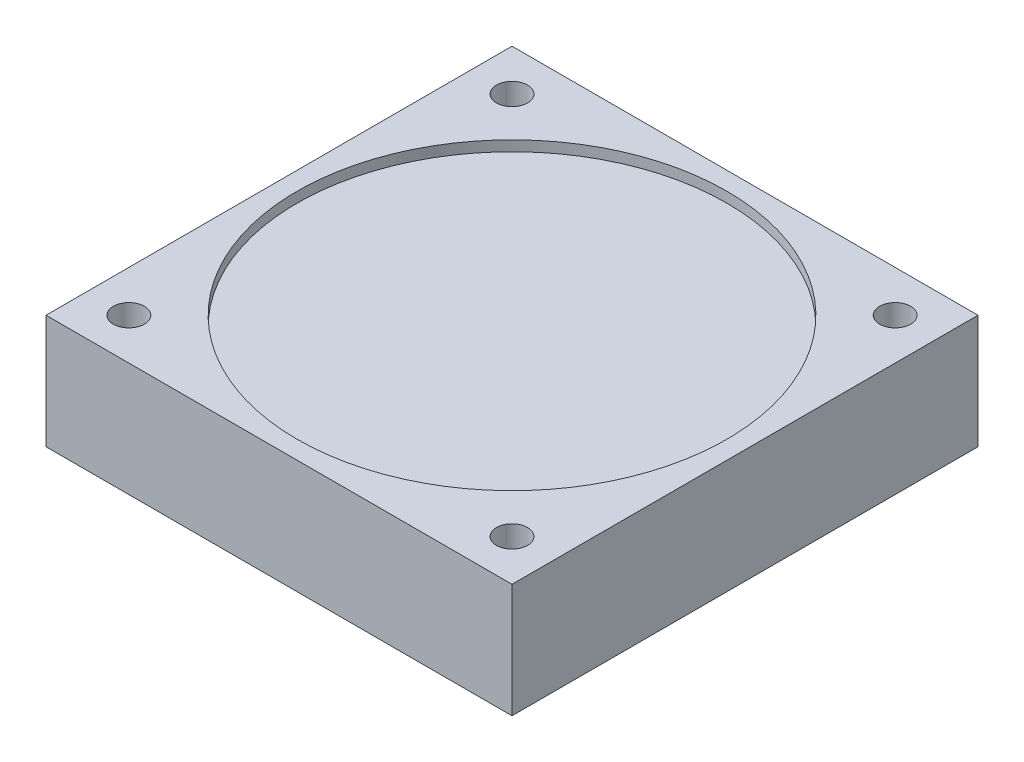
ISO-10303-21;
HEADER;
FILE_DESCRIPTION(('STEP AP214'),'2;1');
FILE_NAME('part.step','',(''),(''),'','','');
FILE_SCHEMA(('AUTOMOTIVE_DESIGN { 1 0 10303 214 1 1 1 1 }'));
ENDSEC;
DATA;
#1=APPLICATION_CONTEXT('core data for automotive mechanical design processes');
#2=APPLICATION_PROTOCOL_DEFINITION('international standard','automotive_design',2000,#1);
#3=PRODUCT_CONTEXT('',#1,'mechanical');
#4=PRODUCT('Part','Part','',(#3));
#5=PRODUCT_RELATED_PRODUCT_CATEGORY('part','',(#4));
#6=PRODUCT_DEFINITION_FORMATION('','',#4);
#7=PRODUCT_DEFINITION_CONTEXT('part definition',#1,'design');
#8=PRODUCT_DEFINITION('design','',#6,#7);
#9=PRODUCT_DEFINITION_SHAPE('','',#8);
#10=(LENGTH_UNIT() NAMED_UNIT(*) SI_UNIT(.MILLI.,.METRE.));
#11=(NAMED_UNIT(*) PLANE_ANGLE_UNIT() SI_UNIT($,.RADIAN.));
#12=(NAMED_UNIT(*) SI_UNIT($,.STERADIAN.) SOLID_ANGLE_UNIT());
#13=UNCERTAINTY_MEASURE_WITH_UNIT(LENGTH_MEASURE(1.E-05),#10,'distance_accuracy_value','');
#14=(GEOMETRIC_REPRESENTATION_CONTEXT(3) GLOBAL_UNCERTAINTY_ASSIGNED_CONTEXT((#13)) GLOBAL_UNIT_ASSIGNED_CONTEXT((#10,
#11,#12)) REPRESENTATION_CONTEXT('',''));
#15=CARTESIAN_POINT('',(0.,0.,0.));
#16=DIRECTION('',(0.,0.,1.));
#17=DIRECTION('',(1.,0.,0.));
#18=AXIS2_PLACEMENT_3D('',#15,#16,#17);
#19=CARTESIAN_POINT('',(0.,11.,0.));
#20=DIRECTION('',(0.,-1.,0.));
#21=DIRECTION('',(0.,0.,-1.));
#22=AXIS2_PLACEMENT_3D('',#19,#20,#21);
#23=PLANE('',#22);
#24=CARTESIAN_POINT('',(-3.66279069767441,11.,-9.81104651162788));
#25=DIRECTION('',(0.,1.,0.));
#26=DIRECTION('',(0.,0.,1.));
#27=AXIS2_PLACEMENT_3D('',#24,#25,#26);
#28=CIRCLE('',#27,20.75);
#29=CARTESIAN_POINT('',(-3.66279069767441,11.,10.9389534883721));
#30=VERTEX_POINT('',#29);
#31=EDGE_CURVE('E148',#30,#30,#28,.T.);
#32=ORIENTED_EDGE('',*,*,#31,.F.);
#33=EDGE_LOOP('',(#32));
#34=FACE_BOUND('',#33,.T.);
#35=DIRECTION('',(0.,0.,1.));
#36=VECTOR('',#35,1.);
#37=CARTESIAN_POINT('',(-26.1627906976744,11.,12.6889534883721));
#38=LINE('',#37,#36);
#39=CARTESIAN_POINT('',(-26.1627906976744,11.,-32.3110465116279));
#40=VERTEX_POINT('',#39);
#41=CARTESIAN_POINT('',(-26.1627906976744,11.,12.6889534883721));
#42=VERTEX_POINT('',#41);
#43=EDGE_CURVE('E97',#40,#42,#38,.T.);
#44=ORIENTED_EDGE('',*,*,#43,.T.);
#45=DIRECTION('',(1.,0.,0.));
#46=VECTOR('',#45,1.);
#47=CARTESIAN_POINT('',(-26.1627906976744,11.,12.6889534883721));
#48=LINE('',#47,#46);
#49=CARTESIAN_POINT('',(18.8372093023256,11.,12.6889534883721));
#50=VERTEX_POINT('',#49);
#51=EDGE_CURVE('E92',#42,#50,#48,.T.);
#52=ORIENTED_EDGE('',*,*,#51,.T.);
#53=DIRECTION('',(0.,0.,-1.));
#54=VECTOR('',#53,1.);
#55=CARTESIAN_POINT('',(18.8372093023256,11.,12.6889534883721));
#56=LINE('',#55,#54);
#57=CARTESIAN_POINT('',(18.8372093023256,11.,-32.3110465116279));
#58=VERTEX_POINT('',#57);
#59=EDGE_CURVE('E95',#50,#58,#56,.T.);
#60=ORIENTED_EDGE('',*,*,#59,.T.);
#61=DIRECTION('',(-1.,0.,0.));
#62=VECTOR('',#61,1.);
#63=CARTESIAN_POINT('',(-26.1627906976744,11.,-32.3110465116279));
#64=LINE('',#63,#62);
#65=EDGE_CURVE('E62',#58,#40,#64,.T.);
#66=ORIENTED_EDGE('',*,*,#65,.T.);
#67=EDGE_LOOP('',(#44,#52,#60,#66));
#68=FACE_BOUND('',#67,.T.);
#69=CARTESIAN_POINT('',(-22.1627906976744,11.,-28.3110465116279));
#70=DIRECTION('',(0.,1.,0.));
#71=DIRECTION('',(0.,0.,1.));
#72=AXIS2_PLACEMENT_3D('',#69,#70,#71);
#73=CIRCLE('',#72,1.5);
#74=CARTESIAN_POINT('',(-22.1627906976744,11.,-26.8110465116279));
#75=VERTEX_POINT('',#74);
#76=EDGE_CURVE('E112',#75,#75,#73,.T.);
#77=ORIENTED_EDGE('',*,*,#76,.F.);
#78=EDGE_LOOP('',(#77));
#79=FACE_BOUND('',#78,.T.);
#80=CARTESIAN_POINT('',(14.8372093023256,11.,-28.3110465116279));
#81=DIRECTION('',(0.,1.,0.));
#82=DIRECTION('',(0.,0.,1.));
#83=AXIS2_PLACEMENT_3D('',#80,#81,#82);
#84=CIRCLE('',#83,1.5);
#85=CARTESIAN_POINT('',(14.8372093023256,11.,-26.8110465116279));
#86=VERTEX_POINT('',#85);
#87=EDGE_CURVE('E127',#86,#86,#84,.T.);
#88=ORIENTED_EDGE('',*,*,#87,.F.);
#89=EDGE_LOOP('',(#88));
#90=FACE_BOUND('',#89,.T.);
#91=CARTESIAN_POINT('',(-22.1627906976744,11.,8.68895348837212));
#92=DIRECTION('',(0.,1.,0.));
#93=DIRECTION('',(0.,0.,1.));
#94=AXIS2_PLACEMENT_3D('',#91,#92,#93);
#95=CIRCLE('',#94,1.5);
#96=CARTESIAN_POINT('',(-22.1627906976744,11.,10.1889534883721));
#97=VERTEX_POINT('',#96);
#98=EDGE_CURVE('E133',#97,#97,#95,.T.);
#99=ORIENTED_EDGE('',*,*,#98,.F.);
#100=EDGE_LOOP('',(#99));
#101=FACE_BOUND('',#100,.T.);
#102=CARTESIAN_POINT('',(14.8372093023256,11.,8.68895348837212));
#103=DIRECTION('',(0.,1.,0.));
#104=DIRECTION('',(0.,0.,1.));
#105=AXIS2_PLACEMENT_3D('',#102,#103,#104);
#106=CIRCLE('',#105,1.5);
#107=CARTESIAN_POINT('',(14.8372093023256,11.,10.1889534883721));
#108=VERTEX_POINT('',#107);
#109=EDGE_CURVE('E139',#108,#108,#106,.T.);
#110=ORIENTED_EDGE('',*,*,#109,.F.);
#111=EDGE_LOOP('',(#110));
#112=FACE_BOUND('',#111,.T.);
#113=ADVANCED_FACE('F45',(#34,#68,#79,#90,#101,#112),#23,.F.);
#114=CARTESIAN_POINT('',(0.,0.,0.));
#115=DIRECTION('',(0.,-1.,0.));
#116=DIRECTION('',(0.,0.,-1.));
#117=AXIS2_PLACEMENT_3D('',#114,#115,#116);
#118=PLANE('',#117);
#119=CARTESIAN_POINT('',(-22.1627906976744,0.,8.68895348837212));
#120=DIRECTION('',(0.,1.,0.));
#121=DIRECTION('',(0.,0.,1.));
#122=AXIS2_PLACEMENT_3D('',#119,#120,#121);
#123=CIRCLE('',#122,1.5);
#124=CARTESIAN_POINT('',(-22.1627906976744,0.,10.1889534883721));
#125=VERTEX_POINT('',#124);
#126=EDGE_CURVE('E136',#125,#125,#123,.T.);
#127=ORIENTED_EDGE('',*,*,#126,.T.);
#128=EDGE_LOOP('',(#127));
#129=FACE_BOUND('',#128,.T.);
#130=CARTESIAN_POINT('',(-22.1627906976744,0.,-28.3110465116279));
#131=DIRECTION('',(0.,1.,0.));
#132=DIRECTION('',(0.,0.,1.));
#133=AXIS2_PLACEMENT_3D('',#130,#131,#132);
#134=CIRCLE('',#133,1.5);
#135=CARTESIAN_POINT('',(-22.1627906976744,0.,-26.8110465116279));
#136=VERTEX_POINT('',#135);
#137=EDGE_CURVE('E124',#136,#136,#134,.T.);
#138=ORIENTED_EDGE('',*,*,#137,.T.);
#139=EDGE_LOOP('',(#138));
#140=FACE_BOUND('',#139,.T.);
#141=DIRECTION('',(0.,0.,1.));
#142=VECTOR('',#141,1.);
#143=CARTESIAN_POINT('',(-26.1627906976744,0.,12.6889534883721));
#144=LINE('',#143,#142);
#145=CARTESIAN_POINT('',(-26.1627906976744,0.,-32.3110465116279));
#146=VERTEX_POINT('',#145);
#147=CARTESIAN_POINT('',(-26.1627906976744,0.,12.6889534883721));
#148=VERTEX_POINT('',#147);
#149=EDGE_CURVE('E109',#146,#148,#144,.T.);
#150=ORIENTED_EDGE('',*,*,#149,.F.);
#151=DIRECTION('',(-1.,0.,0.));
#152=VECTOR('',#151,1.);
#153=CARTESIAN_POINT('',(-26.1627906976744,0.,-32.3110465116279));
#154=LINE('',#153,#152);
#155=CARTESIAN_POINT('',(18.8372093023256,0.,-32.3110465116279));
#156=VERTEX_POINT('',#155);
#157=EDGE_CURVE('E85',#156,#146,#154,.T.);
#158=ORIENTED_EDGE('',*,*,#157,.F.);
#159=DIRECTION('',(0.,0.,-1.));
#160=VECTOR('',#159,1.);
#161=CARTESIAN_POINT('',(18.8372093023256,0.,12.6889534883721));
#162=LINE('',#161,#160);
#163=CARTESIAN_POINT('',(18.8372093023256,0.,12.6889534883721));
#164=VERTEX_POINT('',#163);
#165=EDGE_CURVE('E79',#164,#156,#162,.T.);
#166=ORIENTED_EDGE('',*,*,#165,.F.);
#167=DIRECTION('',(1.,0.,0.));
#168=VECTOR('',#167,1.);
#169=CARTESIAN_POINT('',(-26.1627906976744,0.,12.6889534883721));
#170=LINE('',#169,#168);
#171=EDGE_CURVE('E101',#148,#164,#170,.T.);
#172=ORIENTED_EDGE('',*,*,#171,.F.);
#173=EDGE_LOOP('',(#150,#158,#166,#172));
#174=FACE_BOUND('',#173,.T.);
#175=CARTESIAN_POINT('',(14.8372093023256,0.,-28.3110465116279));
#176=DIRECTION('',(0.,1.,0.));
#177=DIRECTION('',(0.,0.,1.));
#178=AXIS2_PLACEMENT_3D('',#175,#176,#177);
#179=CIRCLE('',#178,1.5);
#180=CARTESIAN_POINT('',(14.8372093023256,0.,-26.8110465116279));
#181=VERTEX_POINT('',#180);
#182=EDGE_CURVE('E130',#181,#181,#179,.T.);
#183=ORIENTED_EDGE('',*,*,#182,.T.);
#184=EDGE_LOOP('',(#183));
#185=FACE_BOUND('',#184,.T.);
#186=CARTESIAN_POINT('',(14.8372093023256,0.,8.68895348837212));
#187=DIRECTION('',(0.,1.,0.));
#188=DIRECTION('',(0.,0.,1.));
#189=AXIS2_PLACEMENT_3D('',#186,#187,#188);
#190=CIRCLE('',#189,1.5);
#191=CARTESIAN_POINT('',(14.8372093023256,0.,10.1889534883721));
#192=VERTEX_POINT('',#191);
#193=EDGE_CURVE('E142',#192,#192,#190,.T.);
#194=ORIENTED_EDGE('',*,*,#193,.T.);
#195=EDGE_LOOP('',(#194));
#196=FACE_BOUND('',#195,.T.);
#197=ADVANCED_FACE('F120',(#129,#140,#174,#185,#196),#118,.T.);
#198=CARTESIAN_POINT('',(-26.1627906976744,11.,12.6889534883721));
#199=DIRECTION('',(1.,0.,0.));
#200=DIRECTION('',(0.,0.,-1.));
#201=AXIS2_PLACEMENT_3D('',#198,#199,#200);
#202=PLANE('',#201);
#203=ORIENTED_EDGE('',*,*,#149,.T.);
#204=DIRECTION('',(0.,-1.,0.));
#205=VECTOR('',#204,1.);
#206=CARTESIAN_POINT('',(-26.1627906976744,11.,12.6889534883721));
#207=LINE('',#206,#205);
#208=EDGE_CURVE('E11',#42,#148,#207,.T.);
#209=ORIENTED_EDGE('',*,*,#208,.F.);
#210=ORIENTED_EDGE('',*,*,#43,.F.);
#211=DIRECTION('',(0.,-1.,0.));
#212=VECTOR('',#211,1.);
#213=CARTESIAN_POINT('',(-26.1627906976744,11.,-32.3110465116279));
#214=LINE('',#213,#212);
#215=EDGE_CURVE('E105',#40,#146,#214,.T.);
#216=ORIENTED_EDGE('',*,*,#215,.T.);
#217=EDGE_LOOP('',(#203,#209,#210,#216));
#218=FACE_BOUND('',#217,.T.);
#219=ADVANCED_FACE('F47',(#218),#202,.F.);
#220=CARTESIAN_POINT('',(-26.1627906976744,11.,12.6889534883721));
#221=DIRECTION('',(0.,0.,-1.));
#222=DIRECTION('',(-1.,0.,0.));
#223=AXIS2_PLACEMENT_3D('',#220,#221,#222);
#224=PLANE('',#223);
#225=ORIENTED_EDGE('',*,*,#171,.T.);
#226=DIRECTION('',(0.,-1.,0.));
#227=VECTOR('',#226,1.);
#228=CARTESIAN_POINT('',(18.8372093023256,11.,12.6889534883721));
#229=LINE('',#228,#227);
#230=EDGE_CURVE('E54',#50,#164,#229,.T.);
#231=ORIENTED_EDGE('',*,*,#230,.F.);
#232=ORIENTED_EDGE('',*,*,#51,.F.);
#233=ORIENTED_EDGE('',*,*,#208,.T.);
#234=EDGE_LOOP('',(#225,#231,#232,#233));
#235=FACE_BOUND('',#234,.T.);
#236=ADVANCED_FACE('F100',(#235),#224,.F.);
#237=CARTESIAN_POINT('',(18.8372093023256,11.,12.6889534883721));
#238=DIRECTION('',(-1.,0.,0.));
#239=DIRECTION('',(0.,0.,1.));
#240=AXIS2_PLACEMENT_3D('',#237,#238,#239);
#241=PLANE('',#240);
#242=ORIENTED_EDGE('',*,*,#165,.T.);
#243=DIRECTION('',(0.,-1.,0.));
#244=VECTOR('',#243,1.);
#245=CARTESIAN_POINT('',(18.8372093023256,11.,-32.3110465116279));
#246=LINE('',#245,#244);
#247=EDGE_CURVE('E102',#58,#156,#246,.T.);
#248=ORIENTED_EDGE('',*,*,#247,.F.);
#249=ORIENTED_EDGE('',*,*,#59,.F.);
#250=ORIENTED_EDGE('',*,*,#230,.T.);
#251=EDGE_LOOP('',(#242,#248,#249,#250));
#252=FACE_BOUND('',#251,.T.);
#253=ADVANCED_FACE('F103',(#252),#241,.F.);
#254=CARTESIAN_POINT('',(-26.1627906976744,11.,-32.3110465116279));
#255=DIRECTION('',(0.,0.,1.));
#256=DIRECTION('',(1.,0.,0.));
#257=AXIS2_PLACEMENT_3D('',#254,#255,#256);
#258=PLANE('',#257);
#259=ORIENTED_EDGE('',*,*,#157,.T.);
#260=ORIENTED_EDGE('',*,*,#215,.F.);
#261=ORIENTED_EDGE('',*,*,#65,.F.);
#262=ORIENTED_EDGE('',*,*,#247,.T.);
#263=EDGE_LOOP('',(#259,#260,#261,#262));
#264=FACE_BOUND('',#263,.T.);
#265=ADVANCED_FACE('F117',(#264),#258,.F.);
#266=CARTESIAN_POINT('',(-22.1627906976744,11.,-28.3110465116279));
#267=DIRECTION('',(0.,-1.,0.));
#268=DIRECTION('',(0.,0.,-1.));
#269=AXIS2_PLACEMENT_3D('',#266,#267,#268);
#270=CYLINDRICAL_SURFACE('',#269,1.5);
#271=ORIENTED_EDGE('',*,*,#76,.T.);
#272=EDGE_LOOP('',(#271));
#273=FACE_BOUND('',#272,.T.);
#274=ORIENTED_EDGE('',*,*,#137,.F.);
#275=EDGE_LOOP('',(#274));
#276=FACE_BOUND('',#275,.T.);
#277=ADVANCED_FACE('F172',(#273,#276),#270,.F.);
#278=CARTESIAN_POINT('',(14.8372093023256,11.,-28.3110465116279));
#279=DIRECTION('',(0.,-1.,0.));
#280=DIRECTION('',(0.,0.,-1.));
#281=AXIS2_PLACEMENT_3D('',#278,#279,#280);
#282=CYLINDRICAL_SURFACE('',#281,1.5);
#283=ORIENTED_EDGE('',*,*,#87,.T.);
#284=EDGE_LOOP('',(#283));
#285=FACE_BOUND('',#284,.T.);
#286=ORIENTED_EDGE('',*,*,#182,.F.);
#287=EDGE_LOOP('',(#286));
#288=FACE_BOUND('',#287,.T.);
#289=ADVANCED_FACE('F217',(#285,#288),#282,.F.);
#290=CARTESIAN_POINT('',(-22.1627906976744,11.,8.68895348837212));
#291=DIRECTION('',(0.,-1.,0.));
#292=DIRECTION('',(0.,0.,-1.));
#293=AXIS2_PLACEMENT_3D('',#290,#291,#292);
#294=CYLINDRICAL_SURFACE('',#293,1.5);
#295=ORIENTED_EDGE('',*,*,#98,.T.);
#296=EDGE_LOOP('',(#295));
#297=FACE_BOUND('',#296,.T.);
#298=ORIENTED_EDGE('',*,*,#126,.F.);
#299=EDGE_LOOP('',(#298));
#300=FACE_BOUND('',#299,.T.);
#301=ADVANCED_FACE('F225',(#297,#300),#294,.F.);
#302=CARTESIAN_POINT('',(14.8372093023256,11.,8.68895348837212));
#303=DIRECTION('',(0.,-1.,0.));
#304=DIRECTION('',(0.,0.,-1.));
#305=AXIS2_PLACEMENT_3D('',#302,#303,#304);
#306=CYLINDRICAL_SURFACE('',#305,1.5);
#307=ORIENTED_EDGE('',*,*,#109,.T.);
#308=EDGE_LOOP('',(#307));
#309=FACE_BOUND('',#308,.T.);
#310=ORIENTED_EDGE('',*,*,#193,.F.);
#311=EDGE_LOOP('',(#310));
#312=FACE_BOUND('',#311,.T.);
#313=ADVANCED_FACE('F159',(#309,#312),#306,.F.);
#314=CARTESIAN_POINT('',(-3.66279069767441,10.,-9.81104651162788));
#315=DIRECTION('',(0.,1.,0.));
#316=DIRECTION('',(0.,0.,1.));
#317=AXIS2_PLACEMENT_3D('',#314,#315,#316);
#318=CYLINDRICAL_SURFACE('',#317,20.75);
#319=CARTESIAN_POINT('',(-3.66279069767441,10.,-9.81104651162788));
#320=DIRECTION('',(0.,1.,0.));
#321=DIRECTION('',(0.,0.,1.));
#322=AXIS2_PLACEMENT_3D('',#319,#320,#321);
#323=CIRCLE('',#322,20.75);
#324=CARTESIAN_POINT('',(-3.66279069767441,10.,10.9389534883721));
#325=VERTEX_POINT('',#324);
#326=EDGE_CURVE('E145',#325,#325,#323,.T.);
#327=ORIENTED_EDGE('',*,*,#326,.F.);
#328=EDGE_LOOP('',(#327));
#329=FACE_BOUND('',#328,.T.);
#330=ORIENTED_EDGE('',*,*,#31,.T.);
#331=EDGE_LOOP('',(#330));
#332=FACE_BOUND('',#331,.T.);
#333=ADVANCED_FACE('F156',(#329,#332),#318,.F.);
#334=CARTESIAN_POINT('',(-3.66279069767441,10.,-9.81104651162788));
#335=DIRECTION('',(0.,1.,0.));
#336=DIRECTION('',(0.,0.,1.));
#337=AXIS2_PLACEMENT_3D('',#334,#335,#336);
#338=PLANE('',#337);
#339=ORIENTED_EDGE('',*,*,#326,.T.);
#340=EDGE_LOOP('',(#339));
#341=FACE_BOUND('',#340,.T.);
#342=ADVANCED_FACE('F154',(#341),#338,.T.);
#343=CLOSED_SHELL('',(#113,#197,#219,#236,#253,#265,#277,#289,#301,#313,#333,#342));
#344=MANIFOLD_SOLID_BREP('B2',#343);
#345=ADVANCED_BREP_SHAPE_REPRESENTATION('',(#18,#344),#14);
#346=SHAPE_DEFINITION_REPRESENTATION(#9,#345);
ENDSEC;
END-ISO-10303-21;
